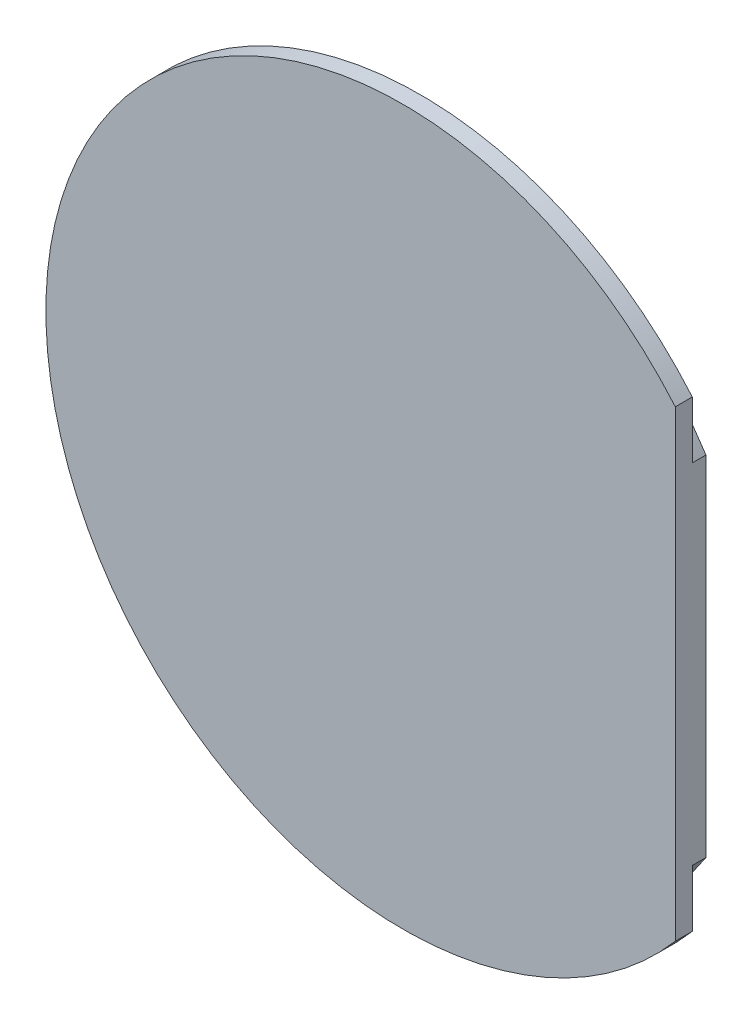
ISO-10303-21;
HEADER;
FILE_DESCRIPTION(('STEP AP214'),'2;1');
FILE_NAME('part.step','',(''),(''),'','','');
FILE_SCHEMA(('AUTOMOTIVE_DESIGN { 1 0 10303 214 1 1 1 1 }'));
ENDSEC;
DATA;
#1=APPLICATION_CONTEXT('core data for automotive mechanical design processes');
#2=APPLICATION_PROTOCOL_DEFINITION('international standard','automotive_design',2000,#1);
#3=PRODUCT_CONTEXT('',#1,'mechanical');
#4=PRODUCT('Part','Part','',(#3));
#5=PRODUCT_RELATED_PRODUCT_CATEGORY('part','',(#4));
#6=PRODUCT_DEFINITION_FORMATION('','',#4);
#7=PRODUCT_DEFINITION_CONTEXT('part definition',#1,'design');
#8=PRODUCT_DEFINITION('design','',#6,#7);
#9=PRODUCT_DEFINITION_SHAPE('','',#8);
#10=(LENGTH_UNIT() NAMED_UNIT(*) SI_UNIT(.MILLI.,.METRE.));
#11=(NAMED_UNIT(*) PLANE_ANGLE_UNIT() SI_UNIT($,.RADIAN.));
#12=(NAMED_UNIT(*) SI_UNIT($,.STERADIAN.) SOLID_ANGLE_UNIT());
#13=UNCERTAINTY_MEASURE_WITH_UNIT(LENGTH_MEASURE(1.E-05),#10,'distance_accuracy_value','');
#14=(GEOMETRIC_REPRESENTATION_CONTEXT(3) GLOBAL_UNCERTAINTY_ASSIGNED_CONTEXT((#13)) GLOBAL_UNIT_ASSIGNED_CONTEXT((#10,
#11,#12)) REPRESENTATION_CONTEXT('',''));
#15=CARTESIAN_POINT('',(0.,0.,0.));
#16=DIRECTION('',(0.,0.,1.));
#17=DIRECTION('',(1.,0.,0.));
#18=AXIS2_PLACEMENT_3D('',#15,#16,#17);
#19=CARTESIAN_POINT('',(0.,0.,-26.));
#20=DIRECTION('',(0.,0.,-1.));
#21=DIRECTION('',(-1.,0.,0.));
#22=AXIS2_PLACEMENT_3D('',#19,#20,#21);
#23=CYLINDRICAL_SURFACE('',#22,21.);
#24=CARTESIAN_POINT('',(0.,0.,-26.));
#25=DIRECTION('',(0.,0.,1.));
#26=DIRECTION('',(1.,0.,0.));
#27=AXIS2_PLACEMENT_3D('',#24,#25,#26);
#28=CIRCLE('',#27,21.);
#29=CARTESIAN_POINT('',(16.,13.6014705087354,-26.));
#30=VERTEX_POINT('',#29);
#31=CARTESIAN_POINT('',(16.,-13.6014705087354,-26.));
#32=VERTEX_POINT('',#31);
#33=EDGE_CURVE('E50',#30,#32,#28,.T.);
#34=ORIENTED_EDGE('',*,*,#33,.F.);
#35=DIRECTION('',(0.,0.,-1.));
#36=VECTOR('',#35,1.);
#37=CARTESIAN_POINT('',(16.,13.6014705087354,-26.));
#38=LINE('',#37,#36);
#39=CARTESIAN_POINT('',(16.,13.6014705087354,-27.));
#40=VERTEX_POINT('',#39);
#41=EDGE_CURVE('E101',#30,#40,#38,.T.);
#42=ORIENTED_EDGE('',*,*,#41,.T.);
#43=CARTESIAN_POINT('',(0.,0.,-27.));
#44=DIRECTION('',(0.,0.,1.));
#45=DIRECTION('',(1.,0.,0.));
#46=AXIS2_PLACEMENT_3D('',#43,#44,#45);
#47=CIRCLE('',#46,21.);
#48=CARTESIAN_POINT('',(16.,-13.6014705087354,-27.));
#49=VERTEX_POINT('',#48);
#50=EDGE_CURVE('E45',#40,#49,#47,.T.);
#51=ORIENTED_EDGE('',*,*,#50,.T.);
#52=DIRECTION('',(0.,0.,-1.));
#53=VECTOR('',#52,1.);
#54=CARTESIAN_POINT('',(16.,-13.6014705087354,-26.));
#55=LINE('',#54,#53);
#56=EDGE_CURVE('E105',#49,#32,#55,.F.);
#57=ORIENTED_EDGE('',*,*,#56,.T.);
#58=EDGE_LOOP('',(#34,#42,#51,#57));
#59=FACE_BOUND('',#58,.T.);
#60=ADVANCED_FACE('F39',(#59),#23,.T.);
#61=CARTESIAN_POINT('',(0.,0.,-26.));
#62=DIRECTION('',(0.,0.,1.));
#63=DIRECTION('',(1.,0.,0.));
#64=AXIS2_PLACEMENT_3D('',#61,#62,#63);
#65=PLANE('',#64);
#66=DIRECTION('',(0.,-1.,0.));
#67=VECTOR('',#66,1.);
#68=CARTESIAN_POINT('',(16.,0.,-26.));
#69=LINE('',#68,#67);
#70=EDGE_CURVE('E110',#30,#32,#69,.T.);
#71=ORIENTED_EDGE('',*,*,#70,.F.);
#72=ORIENTED_EDGE('',*,*,#33,.T.);
#73=EDGE_LOOP('',(#71,#72));
#74=FACE_BOUND('',#73,.T.);
#75=ADVANCED_FACE('F115',(#74),#65,.T.);
#76=CARTESIAN_POINT('',(0.,0.,-27.));
#77=DIRECTION('',(0.,0.,1.));
#78=DIRECTION('',(1.,0.,0.));
#79=AXIS2_PLACEMENT_3D('',#76,#77,#78);
#80=PLANE('',#79);
#81=ORIENTED_EDGE('',*,*,#50,.F.);
#82=DIRECTION('',(0.,-1.,0.));
#83=VECTOR('',#82,1.);
#84=CARTESIAN_POINT('',(16.,0.,-27.));
#85=LINE('',#84,#83);
#86=CARTESIAN_POINT('',(16.,10.2469507659596,-27.));
#87=VERTEX_POINT('',#86);
#88=EDGE_CURVE('E86',#40,#87,#85,.T.);
#89=ORIENTED_EDGE('',*,*,#88,.T.);
#90=CARTESIAN_POINT('',(0.,0.,-27.));
#91=DIRECTION('',(0.,0.,1.));
#92=DIRECTION('',(1.,0.,0.));
#93=AXIS2_PLACEMENT_3D('',#90,#91,#92);
#94=CIRCLE('',#93,19.);
#95=CARTESIAN_POINT('',(16.,-10.2469507659596,-27.));
#96=VERTEX_POINT('',#95);
#97=EDGE_CURVE('E90',#87,#96,#94,.T.);
#98=ORIENTED_EDGE('',*,*,#97,.T.);
#99=EDGE_CURVE('E54',#96,#49,#85,.T.);
#100=ORIENTED_EDGE('',*,*,#99,.T.);
#101=EDGE_LOOP('',(#81,#89,#98,#100));
#102=FACE_BOUND('',#101,.T.);
#103=ADVANCED_FACE('F102',(#102),#80,.F.);
#104=CARTESIAN_POINT('',(0.,0.,-27.));
#105=DIRECTION('',(0.,0.,-1.));
#106=DIRECTION('',(-1.,0.,0.));
#107=AXIS2_PLACEMENT_3D('',#104,#105,#106);
#108=CYLINDRICAL_SURFACE('',#107,19.);
#109=ORIENTED_EDGE('',*,*,#97,.F.);
#110=DIRECTION('',(0.,0.,-1.));
#111=VECTOR('',#110,1.);
#112=CARTESIAN_POINT('',(16.,10.2469507659596,-27.));
#113=LINE('',#112,#111);
#114=CARTESIAN_POINT('',(16.,10.2469507659596,-27.8));
#115=VERTEX_POINT('',#114);
#116=EDGE_CURVE('E65',#87,#115,#113,.T.);
#117=ORIENTED_EDGE('',*,*,#116,.T.);
#118=CARTESIAN_POINT('',(0.,0.,-27.8));
#119=DIRECTION('',(0.,0.,1.));
#120=DIRECTION('',(1.,0.,0.));
#121=AXIS2_PLACEMENT_3D('',#118,#119,#120);
#122=CIRCLE('',#121,19.);
#123=CARTESIAN_POINT('',(16.,-10.2469507659596,-27.8));
#124=VERTEX_POINT('',#123);
#125=EDGE_CURVE('E83',#115,#124,#122,.T.);
#126=ORIENTED_EDGE('',*,*,#125,.T.);
#127=DIRECTION('',(0.,0.,-1.));
#128=VECTOR('',#127,1.);
#129=CARTESIAN_POINT('',(16.,-10.2469507659596,-27.));
#130=LINE('',#129,#128);
#131=EDGE_CURVE('E76',#124,#96,#130,.F.);
#132=ORIENTED_EDGE('',*,*,#131,.T.);
#133=EDGE_LOOP('',(#109,#117,#126,#132));
#134=FACE_BOUND('',#133,.T.);
#135=ADVANCED_FACE('F81',(#134),#108,.T.);
#136=CARTESIAN_POINT('',(0.,0.,-27.8));
#137=DIRECTION('',(0.,0.,1.));
#138=DIRECTION('',(1.,0.,0.));
#139=AXIS2_PLACEMENT_3D('',#136,#137,#138);
#140=PLANE('',#139);
#141=ORIENTED_EDGE('',*,*,#125,.F.);
#142=DIRECTION('',(0.,-1.,0.));
#143=VECTOR('',#142,1.);
#144=CARTESIAN_POINT('',(16.,30.,-27.8));
#145=LINE('',#144,#143);
#146=EDGE_CURVE('E11',#115,#124,#145,.T.);
#147=ORIENTED_EDGE('',*,*,#146,.T.);
#148=EDGE_LOOP('',(#141,#147));
#149=FACE_BOUND('',#148,.T.);
#150=ADVANCED_FACE('F89',(#149),#140,.F.);
#151=CARTESIAN_POINT('',(16.,30.,-27.8));
#152=DIRECTION('',(-1.,0.,0.));
#153=DIRECTION('',(0.,0.,1.));
#154=AXIS2_PLACEMENT_3D('',#151,#152,#153);
#155=PLANE('',#154);
#156=ORIENTED_EDGE('',*,*,#88,.F.);
#157=ORIENTED_EDGE('',*,*,#41,.F.);
#158=ORIENTED_EDGE('',*,*,#70,.T.);
#159=ORIENTED_EDGE('',*,*,#56,.F.);
#160=ORIENTED_EDGE('',*,*,#99,.F.);
#161=ORIENTED_EDGE('',*,*,#131,.F.);
#162=ORIENTED_EDGE('',*,*,#146,.F.);
#163=ORIENTED_EDGE('',*,*,#116,.F.);
#164=EDGE_LOOP('',(#156,#157,#158,#159,#160,#161,#162,#163));
#165=FACE_BOUND('',#164,.T.);
#166=ADVANCED_FACE('F80',(#165),#155,.F.);
#167=CLOSED_SHELL('',(#60,#75,#103,#135,#150,#166));
#168=MANIFOLD_SOLID_BREP('B2',#167);
#169=ADVANCED_BREP_SHAPE_REPRESENTATION('',(#18,#168),#14);
#170=SHAPE_DEFINITION_REPRESENTATION(#9,#169);
ENDSEC;
END-ISO-10303-21;
